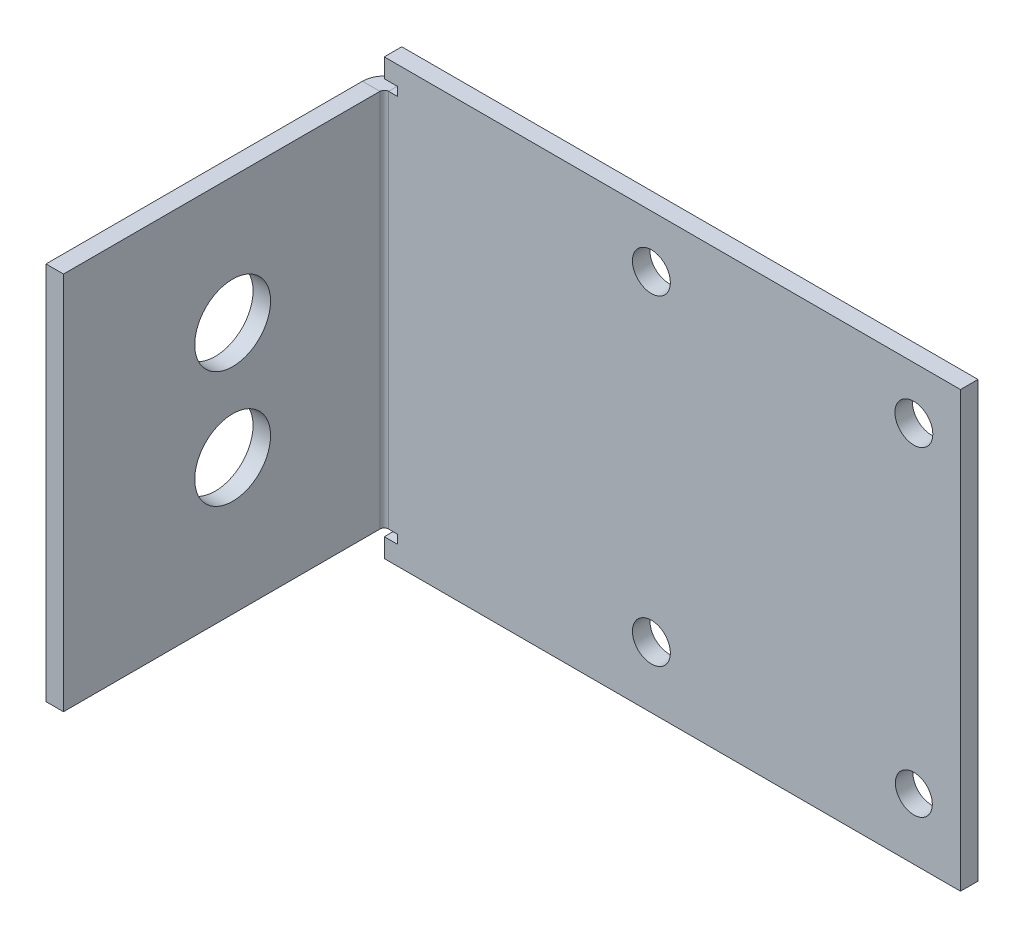
ISO-10303-21;
HEADER;
FILE_DESCRIPTION(('STEP AP214'),'2;1');
FILE_NAME('part.step','',(''),(''),'','','');
FILE_SCHEMA(('AUTOMOTIVE_DESIGN { 1 0 10303 214 1 1 1 1 }'));
ENDSEC;
DATA;
#1=APPLICATION_CONTEXT('core data for automotive mechanical design processes');
#2=APPLICATION_PROTOCOL_DEFINITION('international standard','automotive_design',2000,#1);
#3=PRODUCT_CONTEXT('',#1,'mechanical');
#4=PRODUCT('Part','Part','',(#3));
#5=PRODUCT_RELATED_PRODUCT_CATEGORY('part','',(#4));
#6=PRODUCT_DEFINITION_FORMATION('','',#4);
#7=PRODUCT_DEFINITION_CONTEXT('part definition',#1,'design');
#8=PRODUCT_DEFINITION('design','',#6,#7);
#9=PRODUCT_DEFINITION_SHAPE('','',#8);
#10=(LENGTH_UNIT() NAMED_UNIT(*) SI_UNIT(.MILLI.,.METRE.));
#11=(NAMED_UNIT(*) PLANE_ANGLE_UNIT() SI_UNIT($,.RADIAN.));
#12=(NAMED_UNIT(*) SI_UNIT($,.STERADIAN.) SOLID_ANGLE_UNIT());
#13=UNCERTAINTY_MEASURE_WITH_UNIT(LENGTH_MEASURE(1.E-05),#10,'distance_accuracy_value','');
#14=(GEOMETRIC_REPRESENTATION_CONTEXT(3) GLOBAL_UNCERTAINTY_ASSIGNED_CONTEXT((#13)) GLOBAL_UNIT_ASSIGNED_CONTEXT((#10,
#11,#12)) REPRESENTATION_CONTEXT('',''));
#15=CARTESIAN_POINT('',(0.,0.,0.));
#16=DIRECTION('',(0.,0.,1.));
#17=DIRECTION('',(1.,0.,0.));
#18=AXIS2_PLACEMENT_3D('',#15,#16,#17);
#19=CARTESIAN_POINT('',(-49.4,-37.25,-3.));
#20=DIRECTION('',(-1.,0.,0.));
#21=DIRECTION('',(0.,0.,1.));
#22=AXIS2_PLACEMENT_3D('',#19,#20,#21);
#23=PLANE('',#22);
#24=DIRECTION('',(0.,-1.,0.));
#25=VECTOR('',#24,1.);
#26=CARTESIAN_POINT('',(-49.4,-37.25,0.));
#27=LINE('',#26,#25);
#28=CARTESIAN_POINT('',(-49.4,-34.,0.));
#29=VERTEX_POINT('',#28);
#30=CARTESIAN_POINT('',(-49.4,-37.25,0.));
#31=VERTEX_POINT('',#30);
#32=EDGE_CURVE('E327',#29,#31,#27,.T.);
#33=ORIENTED_EDGE('',*,*,#32,.F.);
#34=DIRECTION('',(0.,0.,-1.));
#35=VECTOR('',#34,1.);
#36=CARTESIAN_POINT('',(-49.4,-34.,0.));
#37=LINE('',#36,#35);
#38=CARTESIAN_POINT('',(-49.4,-34.,-3.));
#39=VERTEX_POINT('',#38);
#40=EDGE_CURVE('E244',#29,#39,#37,.T.);
#41=ORIENTED_EDGE('',*,*,#40,.T.);
#42=DIRECTION('',(0.,-1.,0.));
#43=VECTOR('',#42,1.);
#44=CARTESIAN_POINT('',(-49.4,-37.25,-3.));
#45=LINE('',#44,#43);
#46=CARTESIAN_POINT('',(-49.4,-37.25,-3.));
#47=VERTEX_POINT('',#46);
#48=EDGE_CURVE('E311',#39,#47,#45,.T.);
#49=ORIENTED_EDGE('',*,*,#48,.T.);
#50=DIRECTION('',(0.,0.,1.));
#51=VECTOR('',#50,1.);
#52=CARTESIAN_POINT('',(-49.4,-37.25,-3.));
#53=LINE('',#52,#51);
#54=EDGE_CURVE('E50',#47,#31,#53,.T.);
#55=ORIENTED_EDGE('',*,*,#54,.T.);
#56=EDGE_LOOP('',(#33,#41,#49,#55));
#57=FACE_BOUND('',#56,.T.);
#58=ADVANCED_FACE('F40',(#57),#23,.T.);
#59=CARTESIAN_POINT('',(-49.4,37.25,-3.));
#60=VERTEX_POINT('',#59);
#61=CARTESIAN_POINT('',(-49.4,34.,-3.));
#62=VERTEX_POINT('',#61);
#63=EDGE_CURVE('E312',#60,#62,#45,.T.);
#64=ORIENTED_EDGE('',*,*,#63,.T.);
#65=DIRECTION('',(0.,0.,-1.));
#66=VECTOR('',#65,1.);
#67=CARTESIAN_POINT('',(-49.4,34.,0.));
#68=LINE('',#67,#66);
#69=CARTESIAN_POINT('',(-49.4,34.,0.));
#70=VERTEX_POINT('',#69);
#71=EDGE_CURVE('E268',#70,#62,#68,.T.);
#72=ORIENTED_EDGE('',*,*,#71,.F.);
#73=CARTESIAN_POINT('',(-49.4,37.25,0.));
#74=VERTEX_POINT('',#73);
#75=EDGE_CURVE('E328',#74,#70,#27,.T.);
#76=ORIENTED_EDGE('',*,*,#75,.F.);
#77=DIRECTION('',(0.,0.,1.));
#78=VECTOR('',#77,1.);
#79=CARTESIAN_POINT('',(-49.4,37.25,-3.));
#80=LINE('',#79,#78);
#81=EDGE_CURVE('E335',#60,#74,#80,.T.);
#82=ORIENTED_EDGE('',*,*,#81,.F.);
#83=EDGE_LOOP('',(#64,#72,#76,#82));
#84=FACE_BOUND('',#83,.T.);
#85=ADVANCED_FACE('F361',(#84),#23,.T.);
#86=CARTESIAN_POINT('',(0.,0.,-3.));
#87=DIRECTION('',(0.,0.,-1.));
#88=DIRECTION('',(-1.,0.,0.));
#89=AXIS2_PLACEMENT_3D('',#86,#87,#88);
#90=PLANE('',#89);
#91=CARTESIAN_POINT('',(41.4000000000019,-26.75,-3.));
#92=DIRECTION('',(0.,0.,-1.));
#93=DIRECTION('',(-1.,0.,0.));
#94=AXIS2_PLACEMENT_3D('',#91,#92,#93);
#95=CIRCLE('',#94,3.16643995393087);
#96=CARTESIAN_POINT('',(38.233560046071,-26.75,-3.));
#97=VERTEX_POINT('',#96);
#98=EDGE_CURVE('E414',#97,#97,#95,.T.);
#99=ORIENTED_EDGE('',*,*,#98,.F.);
#100=EDGE_LOOP('',(#99));
#101=FACE_BOUND('',#100,.T.);
#102=CARTESIAN_POINT('',(-3.59999999999815,-26.7500000000001,-3.));
#103=DIRECTION('',(0.,0.,-1.));
#104=DIRECTION('',(-1.,0.,0.));
#105=AXIS2_PLACEMENT_3D('',#102,#103,#104);
#106=CIRCLE('',#105,3.25);
#107=CARTESIAN_POINT('',(-6.84999999999815,-26.7500000000001,-3.));
#108=VERTEX_POINT('',#107);
#109=EDGE_CURVE('E544',#108,#108,#106,.T.);
#110=ORIENTED_EDGE('',*,*,#109,.F.);
#111=EDGE_LOOP('',(#110));
#112=FACE_BOUND('',#111,.T.);
#113=CARTESIAN_POINT('',(-3.59999999999816,28.2499999999999,-3.));
#114=DIRECTION('',(0.,0.,-1.));
#115=DIRECTION('',(-1.,0.,0.));
#116=AXIS2_PLACEMENT_3D('',#113,#114,#115);
#117=CIRCLE('',#116,3.25);
#118=CARTESIAN_POINT('',(-6.84999999999816,28.2499999999999,-3.));
#119=VERTEX_POINT('',#118);
#120=EDGE_CURVE('E527',#119,#119,#117,.T.);
#121=ORIENTED_EDGE('',*,*,#120,.F.);
#122=EDGE_LOOP('',(#121));
#123=FACE_BOUND('',#122,.T.);
#124=CARTESIAN_POINT('',(41.4000000000018,28.25,-3.));
#125=DIRECTION('',(0.,0.,-1.));
#126=DIRECTION('',(-1.,0.,0.));
#127=AXIS2_PLACEMENT_3D('',#124,#125,#126);
#128=CIRCLE('',#127,3.24999999999999);
#129=CARTESIAN_POINT('',(38.1500000000018,28.25,-3.));
#130=VERTEX_POINT('',#129);
#131=EDGE_CURVE('E397',#130,#130,#128,.T.);
#132=ORIENTED_EDGE('',*,*,#131,.F.);
#133=EDGE_LOOP('',(#132));
#134=FACE_BOUND('',#133,.T.);
#135=ORIENTED_EDGE('',*,*,#48,.F.);
#136=DIRECTION('',(1.,0.,0.));
#137=VECTOR('',#136,1.);
#138=CARTESIAN_POINT('',(0.,-34.,-3.));
#139=LINE('',#138,#137);
#140=CARTESIAN_POINT('',(-47.1634,-34.,-3.));
#141=VERTEX_POINT('',#140);
#142=EDGE_CURVE('E58',#39,#141,#139,.T.);
#143=ORIENTED_EDGE('',*,*,#142,.T.);
#144=DIRECTION('',(0.,1.,0.));
#145=VECTOR('',#144,1.);
#146=CARTESIAN_POINT('',(-47.1634,0.,-3.));
#147=LINE('',#146,#145);
#148=CARTESIAN_POINT('',(-47.1634,-32.5,-3.));
#149=VERTEX_POINT('',#148);
#150=EDGE_CURVE('E62',#141,#149,#147,.T.);
#151=ORIENTED_EDGE('',*,*,#150,.T.);
#152=DIRECTION('',(-1.,0.,0.));
#153=VECTOR('',#152,1.);
#154=CARTESIAN_POINT('',(0.,-32.5,-3.));
#155=LINE('',#154,#153);
#156=CARTESIAN_POINT('',(-48.6634,-32.5,-2.99999999999998));
#157=VERTEX_POINT('',#156);
#158=EDGE_CURVE('E294',#149,#157,#155,.T.);
#159=ORIENTED_EDGE('',*,*,#158,.T.);
#160=DIRECTION('',(0.,-1.,0.));
#161=VECTOR('',#160,1.);
#162=CARTESIAN_POINT('',(-48.6634,-32.5,-2.99999999999998));
#163=LINE('',#162,#161);
#164=CARTESIAN_POINT('',(-48.6634,32.5,-3.));
#165=VERTEX_POINT('',#164);
#166=EDGE_CURVE('E161',#157,#165,#163,.F.);
#167=ORIENTED_EDGE('',*,*,#166,.T.);
#168=DIRECTION('',(1.,0.,0.));
#169=VECTOR('',#168,1.);
#170=CARTESIAN_POINT('',(0.,32.5,-3.));
#171=LINE('',#170,#169);
#172=CARTESIAN_POINT('',(-47.1634,32.5,-3.));
#173=VERTEX_POINT('',#172);
#174=EDGE_CURVE('E291',#165,#173,#171,.T.);
#175=ORIENTED_EDGE('',*,*,#174,.T.);
#176=DIRECTION('',(0.,1.,0.));
#177=VECTOR('',#176,1.);
#178=CARTESIAN_POINT('',(-47.1634,0.,-3.));
#179=LINE('',#178,#177);
#180=CARTESIAN_POINT('',(-47.1634,34.,-3.));
#181=VERTEX_POINT('',#180);
#182=EDGE_CURVE('E288',#173,#181,#179,.T.);
#183=ORIENTED_EDGE('',*,*,#182,.T.);
#184=DIRECTION('',(-1.,0.,0.));
#185=VECTOR('',#184,1.);
#186=CARTESIAN_POINT('',(0.,34.,-3.));
#187=LINE('',#186,#185);
#188=EDGE_CURVE('E243',#181,#62,#187,.T.);
#189=ORIENTED_EDGE('',*,*,#188,.T.);
#190=ORIENTED_EDGE('',*,*,#63,.F.);
#191=DIRECTION('',(-1.,0.,0.));
#192=VECTOR('',#191,1.);
#193=CARTESIAN_POINT('',(-49.4,37.25,-3.));
#194=LINE('',#193,#192);
#195=CARTESIAN_POINT('',(49.4,37.25,-3.));
#196=VERTEX_POINT('',#195);
#197=EDGE_CURVE('E306',#196,#60,#194,.T.);
#198=ORIENTED_EDGE('',*,*,#197,.F.);
#199=DIRECTION('',(0.,1.,0.));
#200=VECTOR('',#199,1.);
#201=CARTESIAN_POINT('',(49.4,-37.25,-3.));
#202=LINE('',#201,#200);
#203=CARTESIAN_POINT('',(49.4,-37.25,-3.));
#204=VERTEX_POINT('',#203);
#205=EDGE_CURVE('E302',#204,#196,#202,.T.);
#206=ORIENTED_EDGE('',*,*,#205,.F.);
#207=DIRECTION('',(1.,0.,0.));
#208=VECTOR('',#207,1.);
#209=CARTESIAN_POINT('',(-49.4,-37.25,-3.));
#210=LINE('',#209,#208);
#211=EDGE_CURVE('E316',#47,#204,#210,.T.);
#212=ORIENTED_EDGE('',*,*,#211,.F.);
#213=EDGE_LOOP('',(#135,#143,#151,#159,#167,#175,#183,#189,#190,#198,#206,#212));
#214=FACE_BOUND('',#213,.T.);
#215=ADVANCED_FACE('F356',(#101,#112,#123,#134,#214),#90,.T.);
#216=CARTESIAN_POINT('',(0.,0.,0.));
#217=DIRECTION('',(0.,0.,-1.));
#218=DIRECTION('',(-1.,0.,0.));
#219=AXIS2_PLACEMENT_3D('',#216,#217,#218);
#220=PLANE('',#219);
#221=CARTESIAN_POINT('',(41.4000000000019,-26.75,0.));
#222=DIRECTION('',(0.,0.,1.));
#223=DIRECTION('',(1.,0.,0.));
#224=AXIS2_PLACEMENT_3D('',#221,#222,#223);
#225=CIRCLE('',#224,3.16643995393087);
#226=CARTESIAN_POINT('',(44.5664399539327,-26.75,0.));
#227=VERTEX_POINT('',#226);
#228=EDGE_CURVE('E535',#227,#227,#225,.T.);
#229=ORIENTED_EDGE('',*,*,#228,.F.);
#230=EDGE_LOOP('',(#229));
#231=FACE_BOUND('',#230,.T.);
#232=CARTESIAN_POINT('',(-3.59999999999815,-26.7500000000001,0.));
#233=DIRECTION('',(0.,0.,1.));
#234=DIRECTION('',(1.,0.,0.));
#235=AXIS2_PLACEMENT_3D('',#232,#233,#234);
#236=CIRCLE('',#235,3.25);
#237=CARTESIAN_POINT('',(-0.34999999999815,-26.7500000000001,0.));
#238=VERTEX_POINT('',#237);
#239=EDGE_CURVE('E531',#238,#238,#236,.T.);
#240=ORIENTED_EDGE('',*,*,#239,.F.);
#241=EDGE_LOOP('',(#240));
#242=FACE_BOUND('',#241,.T.);
#243=CARTESIAN_POINT('',(-3.59999999999816,28.2499999999999,0.));
#244=DIRECTION('',(0.,0.,1.));
#245=DIRECTION('',(1.,0.,0.));
#246=AXIS2_PLACEMENT_3D('',#243,#244,#245);
#247=CIRCLE('',#246,3.25);
#248=CARTESIAN_POINT('',(-0.349999999998164,28.2499999999999,0.));
#249=VERTEX_POINT('',#248);
#250=EDGE_CURVE('E398',#249,#249,#247,.T.);
#251=ORIENTED_EDGE('',*,*,#250,.F.);
#252=EDGE_LOOP('',(#251));
#253=FACE_BOUND('',#252,.T.);
#254=CARTESIAN_POINT('',(41.4000000000018,28.25,0.));
#255=DIRECTION('',(0.,0.,1.));
#256=DIRECTION('',(1.,0.,0.));
#257=AXIS2_PLACEMENT_3D('',#254,#255,#256);
#258=CIRCLE('',#257,3.24999999999999);
#259=CARTESIAN_POINT('',(44.6500000000018,28.25,0.));
#260=VERTEX_POINT('',#259);
#261=EDGE_CURVE('E395',#260,#260,#258,.T.);
#262=ORIENTED_EDGE('',*,*,#261,.F.);
#263=EDGE_LOOP('',(#262));
#264=FACE_BOUND('',#263,.T.);
#265=DIRECTION('',(1.,0.,0.));
#266=VECTOR('',#265,1.);
#267=CARTESIAN_POINT('',(-49.4,-34.,0.));
#268=LINE('',#267,#266);
#269=CARTESIAN_POINT('',(-47.1634,-34.,0.));
#270=VERTEX_POINT('',#269);
#271=EDGE_CURVE('E239',#29,#270,#268,.T.);
#272=ORIENTED_EDGE('',*,*,#271,.F.);
#273=ORIENTED_EDGE('',*,*,#32,.T.);
#274=DIRECTION('',(1.,0.,0.));
#275=VECTOR('',#274,1.);
#276=CARTESIAN_POINT('',(-49.4,-37.25,0.));
#277=LINE('',#276,#275);
#278=CARTESIAN_POINT('',(49.4,-37.25,0.));
#279=VERTEX_POINT('',#278);
#280=EDGE_CURVE('E307',#31,#279,#277,.T.);
#281=ORIENTED_EDGE('',*,*,#280,.T.);
#282=DIRECTION('',(0.,1.,0.));
#283=VECTOR('',#282,1.);
#284=CARTESIAN_POINT('',(49.4,-37.25,0.));
#285=LINE('',#284,#283);
#286=CARTESIAN_POINT('',(49.4,37.25,0.));
#287=VERTEX_POINT('',#286);
#288=EDGE_CURVE('E301',#279,#287,#285,.T.);
#289=ORIENTED_EDGE('',*,*,#288,.T.);
#290=DIRECTION('',(-1.,0.,0.));
#291=VECTOR('',#290,1.);
#292=CARTESIAN_POINT('',(-49.4,37.25,0.));
#293=LINE('',#292,#291);
#294=EDGE_CURVE('E323',#287,#74,#293,.T.);
#295=ORIENTED_EDGE('',*,*,#294,.T.);
#296=ORIENTED_EDGE('',*,*,#75,.T.);
#297=DIRECTION('',(-1.,0.,0.));
#298=VECTOR('',#297,1.);
#299=CARTESIAN_POINT('',(-47.1634,34.,0.));
#300=LINE('',#299,#298);
#301=CARTESIAN_POINT('',(-47.1634,34.,0.));
#302=VERTEX_POINT('',#301);
#303=EDGE_CURVE('E264',#302,#70,#300,.T.);
#304=ORIENTED_EDGE('',*,*,#303,.F.);
#305=DIRECTION('',(0.,1.,0.));
#306=VECTOR('',#305,1.);
#307=CARTESIAN_POINT('',(-47.1634,32.5,0.));
#308=LINE('',#307,#306);
#309=CARTESIAN_POINT('',(-47.1634,32.5,0.));
#310=VERTEX_POINT('',#309);
#311=EDGE_CURVE('E259',#310,#302,#308,.T.);
#312=ORIENTED_EDGE('',*,*,#311,.F.);
#313=DIRECTION('',(1.,0.,0.));
#314=VECTOR('',#313,1.);
#315=CARTESIAN_POINT('',(-48.6634,32.5,0.));
#316=LINE('',#315,#314);
#317=CARTESIAN_POINT('',(-48.6634,32.5,0.));
#318=VERTEX_POINT('',#317);
#319=EDGE_CURVE('E255',#318,#310,#316,.T.);
#320=ORIENTED_EDGE('',*,*,#319,.F.);
#321=DIRECTION('',(0.,-1.,0.));
#322=VECTOR('',#321,1.);
#323=CARTESIAN_POINT('',(-48.6634,-32.5,0.));
#324=LINE('',#323,#322);
#325=CARTESIAN_POINT('',(-48.6634,-32.5,0.));
#326=VERTEX_POINT('',#325);
#327=EDGE_CURVE('E226',#326,#318,#324,.F.);
#328=ORIENTED_EDGE('',*,*,#327,.F.);
#329=DIRECTION('',(-1.,0.,0.));
#330=VECTOR('',#329,1.);
#331=CARTESIAN_POINT('',(-47.1634,-32.5,0.));
#332=LINE('',#331,#330);
#333=CARTESIAN_POINT('',(-47.1634,-32.5,0.));
#334=VERTEX_POINT('',#333);
#335=EDGE_CURVE('E250',#334,#326,#332,.T.);
#336=ORIENTED_EDGE('',*,*,#335,.F.);
#337=DIRECTION('',(0.,1.,0.));
#338=VECTOR('',#337,1.);
#339=CARTESIAN_POINT('',(-47.1634,-34.,0.));
#340=LINE('',#339,#338);
#341=EDGE_CURVE('E245',#270,#334,#340,.T.);
#342=ORIENTED_EDGE('',*,*,#341,.F.);
#343=EDGE_LOOP('',(#272,#273,#281,#289,#295,#296,#304,#312,#320,#328,#336,#342));
#344=FACE_BOUND('',#343,.T.);
#345=ADVANCED_FACE('F349',(#231,#242,#253,#264,#344),#220,.F.);
#346=CARTESIAN_POINT('',(49.4,-37.25,-3.));
#347=DIRECTION('',(1.,0.,0.));
#348=DIRECTION('',(0.,0.,-1.));
#349=AXIS2_PLACEMENT_3D('',#346,#347,#348);
#350=PLANE('',#349);
#351=ORIENTED_EDGE('',*,*,#288,.F.);
#352=DIRECTION('',(0.,0.,1.));
#353=VECTOR('',#352,1.);
#354=CARTESIAN_POINT('',(49.4,-37.25,-3.));
#355=LINE('',#354,#353);
#356=EDGE_CURVE('E11',#204,#279,#355,.T.);
#357=ORIENTED_EDGE('',*,*,#356,.F.);
#358=ORIENTED_EDGE('',*,*,#205,.T.);
#359=DIRECTION('',(0.,0.,1.));
#360=VECTOR('',#359,1.);
#361=CARTESIAN_POINT('',(49.4,37.25,-3.));
#362=LINE('',#361,#360);
#363=EDGE_CURVE('E44',#196,#287,#362,.T.);
#364=ORIENTED_EDGE('',*,*,#363,.T.);
#365=EDGE_LOOP('',(#351,#357,#358,#364));
#366=FACE_BOUND('',#365,.T.);
#367=ADVANCED_FACE('F42',(#366),#350,.T.);
#368=CARTESIAN_POINT('',(-49.4,-37.25,-3.));
#369=DIRECTION('',(0.,-1.,0.));
#370=DIRECTION('',(0.,0.,-1.));
#371=AXIS2_PLACEMENT_3D('',#368,#369,#370);
#372=PLANE('',#371);
#373=ORIENTED_EDGE('',*,*,#280,.F.);
#374=ORIENTED_EDGE('',*,*,#54,.F.);
#375=ORIENTED_EDGE('',*,*,#211,.T.);
#376=ORIENTED_EDGE('',*,*,#356,.T.);
#377=EDGE_LOOP('',(#373,#374,#375,#376));
#378=FACE_BOUND('',#377,.T.);
#379=ADVANCED_FACE('F354',(#378),#372,.T.);
#380=CARTESIAN_POINT('',(-49.4,37.25,-3.));
#381=DIRECTION('',(0.,1.,0.));
#382=DIRECTION('',(0.,0.,1.));
#383=AXIS2_PLACEMENT_3D('',#380,#381,#382);
#384=PLANE('',#383);
#385=ORIENTED_EDGE('',*,*,#294,.F.);
#386=ORIENTED_EDGE('',*,*,#363,.F.);
#387=ORIENTED_EDGE('',*,*,#197,.T.);
#388=ORIENTED_EDGE('',*,*,#81,.T.);
#389=EDGE_LOOP('',(#385,#386,#387,#388));
#390=FACE_BOUND('',#389,.T.);
#391=ADVANCED_FACE('F347',(#390),#384,.T.);
#392=CARTESIAN_POINT('',(-49.4,-34.,0.));
#393=DIRECTION('',(0.,1.,0.));
#394=DIRECTION('',(0.,0.,1.));
#395=AXIS2_PLACEMENT_3D('',#392,#393,#394);
#396=PLANE('',#395);
#397=ORIENTED_EDGE('',*,*,#142,.F.);
#398=ORIENTED_EDGE('',*,*,#40,.F.);
#399=ORIENTED_EDGE('',*,*,#271,.T.);
#400=DIRECTION('',(0.,0.,-1.));
#401=VECTOR('',#400,1.);
#402=CARTESIAN_POINT('',(-47.1634,-34.,0.));
#403=LINE('',#402,#401);
#404=EDGE_CURVE('E249',#270,#141,#403,.T.);
#405=ORIENTED_EDGE('',*,*,#404,.T.);
#406=EDGE_LOOP('',(#397,#398,#399,#405));
#407=FACE_BOUND('',#406,.T.);
#408=ADVANCED_FACE('F390',(#407),#396,.T.);
#409=CARTESIAN_POINT('',(-47.1634,-34.,0.));
#410=DIRECTION('',(-1.,0.,0.));
#411=DIRECTION('',(0.,0.,1.));
#412=AXIS2_PLACEMENT_3D('',#409,#410,#411);
#413=PLANE('',#412);
#414=ORIENTED_EDGE('',*,*,#150,.F.);
#415=ORIENTED_EDGE('',*,*,#404,.F.);
#416=ORIENTED_EDGE('',*,*,#341,.T.);
#417=DIRECTION('',(0.,0.,-1.));
#418=VECTOR('',#417,1.);
#419=CARTESIAN_POINT('',(-47.1634,-32.5,0.));
#420=LINE('',#419,#418);
#421=EDGE_CURVE('E254',#334,#149,#420,.T.);
#422=ORIENTED_EDGE('',*,*,#421,.T.);
#423=EDGE_LOOP('',(#414,#415,#416,#422));
#424=FACE_BOUND('',#423,.T.);
#425=ADVANCED_FACE('F387',(#424),#413,.T.);
#426=CARTESIAN_POINT('',(-47.1634,-32.5,0.));
#427=DIRECTION('',(0.,-1.,0.));
#428=DIRECTION('',(0.,0.,-1.));
#429=AXIS2_PLACEMENT_3D('',#426,#427,#428);
#430=PLANE('',#429);
#431=ORIENTED_EDGE('',*,*,#158,.F.);
#432=ORIENTED_EDGE('',*,*,#421,.F.);
#433=ORIENTED_EDGE('',*,*,#335,.T.);
#434=DIRECTION('',(0.,0.,-1.));
#435=VECTOR('',#434,1.);
#436=CARTESIAN_POINT('',(-48.6634,-32.5,0.));
#437=LINE('',#436,#435);
#438=EDGE_CURVE('E221',#326,#157,#437,.T.);
#439=ORIENTED_EDGE('',*,*,#438,.T.);
#440=EDGE_LOOP('',(#431,#432,#433,#439));
#441=FACE_BOUND('',#440,.T.);
#442=ADVANCED_FACE('F381',(#441),#430,.T.);
#443=CARTESIAN_POINT('',(-48.6634,32.5,0.));
#444=DIRECTION('',(0.,1.,0.));
#445=DIRECTION('',(0.,0.,1.));
#446=AXIS2_PLACEMENT_3D('',#443,#444,#445);
#447=PLANE('',#446);
#448=ORIENTED_EDGE('',*,*,#174,.F.);
#449=DIRECTION('',(0.,0.,-1.));
#450=VECTOR('',#449,1.);
#451=CARTESIAN_POINT('',(-48.6634,32.5,0.));
#452=LINE('',#451,#450);
#453=EDGE_CURVE('E231',#318,#165,#452,.T.);
#454=ORIENTED_EDGE('',*,*,#453,.F.);
#455=ORIENTED_EDGE('',*,*,#319,.T.);
#456=DIRECTION('',(0.,0.,-1.));
#457=VECTOR('',#456,1.);
#458=CARTESIAN_POINT('',(-47.1634,32.5,0.));
#459=LINE('',#458,#457);
#460=EDGE_CURVE('E263',#310,#173,#459,.T.);
#461=ORIENTED_EDGE('',*,*,#460,.T.);
#462=EDGE_LOOP('',(#448,#454,#455,#461));
#463=FACE_BOUND('',#462,.T.);
#464=ADVANCED_FACE('F374',(#463),#447,.T.);
#465=CARTESIAN_POINT('',(-47.1634,32.5,0.));
#466=DIRECTION('',(-1.,0.,0.));
#467=DIRECTION('',(0.,0.,1.));
#468=AXIS2_PLACEMENT_3D('',#465,#466,#467);
#469=PLANE('',#468);
#470=ORIENTED_EDGE('',*,*,#182,.F.);
#471=ORIENTED_EDGE('',*,*,#460,.F.);
#472=ORIENTED_EDGE('',*,*,#311,.T.);
#473=DIRECTION('',(0.,0.,-1.));
#474=VECTOR('',#473,1.);
#475=CARTESIAN_POINT('',(-47.1634,34.,0.));
#476=LINE('',#475,#474);
#477=EDGE_CURVE('E235',#302,#181,#476,.T.);
#478=ORIENTED_EDGE('',*,*,#477,.T.);
#479=EDGE_LOOP('',(#470,#471,#472,#478));
#480=FACE_BOUND('',#479,.T.);
#481=ADVANCED_FACE('F371',(#480),#469,.T.);
#482=CARTESIAN_POINT('',(-47.1634,34.,0.));
#483=DIRECTION('',(0.,-1.,0.));
#484=DIRECTION('',(0.,0.,-1.));
#485=AXIS2_PLACEMENT_3D('',#482,#483,#484);
#486=PLANE('',#485);
#487=ORIENTED_EDGE('',*,*,#188,.F.);
#488=ORIENTED_EDGE('',*,*,#477,.F.);
#489=ORIENTED_EDGE('',*,*,#303,.T.);
#490=ORIENTED_EDGE('',*,*,#71,.T.);
#491=EDGE_LOOP('',(#487,#488,#489,#490));
#492=FACE_BOUND('',#491,.T.);
#493=ADVANCED_FACE('F363',(#492),#486,.T.);
#494=CARTESIAN_POINT('',(-48.6634,32.5,0.736600000000013));
#495=DIRECTION('',(0.,1.,0.));
#496=DIRECTION('',(0.,0.,1.));
#497=AXIS2_PLACEMENT_3D('',#494,#495,#496);
#498=PLANE('',#497);
#499=DIRECTION('',(-1.,0.,0.));
#500=VECTOR('',#499,1.);
#501=CARTESIAN_POINT('',(-49.4,32.5,0.736600000000011));
#502=LINE('',#501,#500);
#503=CARTESIAN_POINT('',(-49.4,32.5,0.736600000000011));
#504=VERTEX_POINT('',#503);
#505=CARTESIAN_POINT('',(-52.4,32.4999999999999,0.7366));
#506=VERTEX_POINT('',#505);
#507=EDGE_CURVE('E422',#504,#506,#502,.T.);
#508=ORIENTED_EDGE('',*,*,#507,.F.);
#509=CARTESIAN_POINT('',(-48.6634,32.5,0.736600000000013));
#510=DIRECTION('',(0.,-1.,0.));
#511=DIRECTION('',(0.,0.,-1.));
#512=AXIS2_PLACEMENT_3D('',#509,#510,#511);
#513=CIRCLE('',#512,0.736599999999997);
#514=EDGE_CURVE('E164',#318,#504,#513,.F.);
#515=ORIENTED_EDGE('',*,*,#514,.F.);
#516=ORIENTED_EDGE('',*,*,#453,.T.);
#517=CARTESIAN_POINT('',(-48.6634,32.4999999999999,0.736600000000013));
#518=DIRECTION('',(0.,-1.,0.));
#519=DIRECTION('',(0.,0.,-1.));
#520=AXIS2_PLACEMENT_3D('',#517,#518,#519);
#521=CIRCLE('',#520,3.7366);
#522=EDGE_CURVE('E219',#165,#506,#521,.F.);
#523=ORIENTED_EDGE('',*,*,#522,.T.);
#524=EDGE_LOOP('',(#508,#515,#516,#523));
#525=FACE_BOUND('',#524,.T.);
#526=ADVANCED_FACE('F377',(#525),#498,.T.);
#527=CARTESIAN_POINT('',(-48.6634,-32.5,0.736600000000013));
#528=DIRECTION('',(0.,1.,0.));
#529=DIRECTION('',(0.,0.,1.));
#530=AXIS2_PLACEMENT_3D('',#527,#528,#529);
#531=PLANE('',#530);
#532=CARTESIAN_POINT('',(-48.6634,-32.5,0.736600000000013));
#533=DIRECTION('',(0.,-1.,0.));
#534=DIRECTION('',(0.,0.,-1.));
#535=AXIS2_PLACEMENT_3D('',#532,#533,#534);
#536=CIRCLE('',#535,0.736599999999997);
#537=CARTESIAN_POINT('',(-49.4,-32.5,0.736600000000011));
#538=VERTEX_POINT('',#537);
#539=EDGE_CURVE('E171',#538,#326,#536,.T.);
#540=ORIENTED_EDGE('',*,*,#539,.F.);
#541=DIRECTION('',(-1.,0.,0.));
#542=VECTOR('',#541,1.);
#543=CARTESIAN_POINT('',(-49.4,-32.5,0.736600000000011));
#544=LINE('',#543,#542);
#545=CARTESIAN_POINT('',(-52.4,-32.5,0.7366));
#546=VERTEX_POINT('',#545);
#547=EDGE_CURVE('E168',#538,#546,#544,.T.);
#548=ORIENTED_EDGE('',*,*,#547,.T.);
#549=CARTESIAN_POINT('',(-48.6634,-32.5,0.736600000000013));
#550=DIRECTION('',(0.,-1.,0.));
#551=DIRECTION('',(0.,0.,-1.));
#552=AXIS2_PLACEMENT_3D('',#549,#550,#551);
#553=CIRCLE('',#552,3.7366);
#554=EDGE_CURVE('E154',#546,#157,#553,.T.);
#555=ORIENTED_EDGE('',*,*,#554,.T.);
#556=ORIENTED_EDGE('',*,*,#438,.F.);
#557=EDGE_LOOP('',(#540,#548,#555,#556));
#558=FACE_BOUND('',#557,.T.);
#559=ADVANCED_FACE('F169',(#558),#531,.F.);
#560=CARTESIAN_POINT('',(-48.6634,-32.5,0.736600000000013));
#561=DIRECTION('',(0.,-1.,0.));
#562=DIRECTION('',(-1.,0.,0.));
#563=AXIS2_PLACEMENT_3D('',#560,#561,#562);
#564=CYLINDRICAL_SURFACE('',#563,3.7366);
#565=ORIENTED_EDGE('',*,*,#166,.F.);
#566=ORIENTED_EDGE('',*,*,#554,.F.);
#567=DIRECTION('',(0.,1.,0.));
#568=VECTOR('',#567,1.);
#569=CARTESIAN_POINT('',(-52.4,0.,0.7366));
#570=LINE('',#569,#568);
#571=EDGE_CURVE('E158',#546,#506,#570,.T.);
#572=ORIENTED_EDGE('',*,*,#571,.T.);
#573=ORIENTED_EDGE('',*,*,#522,.F.);
#574=EDGE_LOOP('',(#565,#566,#572,#573));
#575=FACE_BOUND('',#574,.T.);
#576=ADVANCED_FACE('F156',(#575),#564,.T.);
#577=CARTESIAN_POINT('',(-48.6634,-32.5,0.736600000000013));
#578=DIRECTION('',(0.,-1.,0.));
#579=DIRECTION('',(-1.,0.,0.));
#580=AXIS2_PLACEMENT_3D('',#577,#578,#579);
#581=CYLINDRICAL_SURFACE('',#580,0.736599999999997);
#582=ORIENTED_EDGE('',*,*,#327,.T.);
#583=ORIENTED_EDGE('',*,*,#514,.T.);
#584=DIRECTION('',(0.,-1.,0.));
#585=VECTOR('',#584,1.);
#586=CARTESIAN_POINT('',(-49.4,32.5,0.736600000000011));
#587=LINE('',#586,#585);
#588=EDGE_CURVE('E176',#504,#538,#587,.T.);
#589=ORIENTED_EDGE('',*,*,#588,.T.);
#590=ORIENTED_EDGE('',*,*,#539,.T.);
#591=EDGE_LOOP('',(#582,#583,#589,#590));
#592=FACE_BOUND('',#591,.T.);
#593=ADVANCED_FACE('F383',(#592),#581,.F.);
#594=CARTESIAN_POINT('',(-52.4,32.5,0.));
#595=DIRECTION('',(0.,-1.,0.));
#596=DIRECTION('',(0.,0.,-1.));
#597=AXIS2_PLACEMENT_3D('',#594,#595,#596);
#598=PLANE('',#597);
#599=ORIENTED_EDGE('',*,*,#507,.T.);
#600=DIRECTION('',(0.,0.,-1.));
#601=VECTOR('',#600,1.);
#602=CARTESIAN_POINT('',(-52.4,32.5,0.));
#603=LINE('',#602,#601);
#604=CARTESIAN_POINT('',(-52.4000000000002,32.5,55.));
#605=VERTEX_POINT('',#604);
#606=EDGE_CURVE('E184',#605,#506,#603,.T.);
#607=ORIENTED_EDGE('',*,*,#606,.F.);
#608=DIRECTION('',(1.,0.,0.));
#609=VECTOR('',#608,1.);
#610=CARTESIAN_POINT('',(-52.4000000000002,32.5,55.));
#611=LINE('',#610,#609);
#612=CARTESIAN_POINT('',(-49.4000000000002,32.5,55.));
#613=VERTEX_POINT('',#612);
#614=EDGE_CURVE('E198',#605,#613,#611,.T.);
#615=ORIENTED_EDGE('',*,*,#614,.T.);
#616=DIRECTION('',(0.,0.,-1.));
#617=VECTOR('',#616,1.);
#618=CARTESIAN_POINT('',(-49.4,32.5,0.));
#619=LINE('',#618,#617);
#620=EDGE_CURVE('E186',#613,#504,#619,.T.);
#621=ORIENTED_EDGE('',*,*,#620,.T.);
#622=EDGE_LOOP('',(#599,#607,#615,#621));
#623=FACE_BOUND('',#622,.T.);
#624=ADVANCED_FACE('F427',(#623),#598,.F.);
#625=CARTESIAN_POINT('',(-52.4000000000002,-32.5,55.));
#626=DIRECTION('',(0.,1.,0.));
#627=DIRECTION('',(0.,0.,1.));
#628=AXIS2_PLACEMENT_3D('',#625,#626,#627);
#629=PLANE('',#628);
#630=ORIENTED_EDGE('',*,*,#547,.F.);
#631=DIRECTION('',(0.,0.,1.));
#632=VECTOR('',#631,1.);
#633=CARTESIAN_POINT('',(-49.4000000000002,-32.5,55.));
#634=LINE('',#633,#632);
#635=CARTESIAN_POINT('',(-49.4000000000002,-32.5,55.));
#636=VERTEX_POINT('',#635);
#637=EDGE_CURVE('E207',#538,#636,#634,.T.);
#638=ORIENTED_EDGE('',*,*,#637,.T.);
#639=DIRECTION('',(1.,0.,0.));
#640=VECTOR('',#639,1.);
#641=CARTESIAN_POINT('',(-52.4000000000002,-32.5,55.));
#642=LINE('',#641,#640);
#643=CARTESIAN_POINT('',(-52.4000000000002,-32.5,55.));
#644=VERTEX_POINT('',#643);
#645=EDGE_CURVE('E190',#644,#636,#642,.T.);
#646=ORIENTED_EDGE('',*,*,#645,.F.);
#647=DIRECTION('',(0.,0.,1.));
#648=VECTOR('',#647,1.);
#649=CARTESIAN_POINT('',(-52.4000000000002,-32.5,55.));
#650=LINE('',#649,#648);
#651=EDGE_CURVE('E181',#546,#644,#650,.T.);
#652=ORIENTED_EDGE('',*,*,#651,.F.);
#653=EDGE_LOOP('',(#630,#638,#646,#652));
#654=FACE_BOUND('',#653,.T.);
#655=ADVANCED_FACE('F188',(#654),#629,.F.);
#656=CARTESIAN_POINT('',(-52.4,0.,-1.84981317614429E-13));
#657=DIRECTION('',(1.,0.,0.));
#658=DIRECTION('',(0.,0.,-1.));
#659=AXIS2_PLACEMENT_3D('',#656,#657,#658);
#660=PLANE('',#659);
#661=CARTESIAN_POINT('',(-52.4000000000001,10.7500000000194,25.9999999999886));
#662=DIRECTION('',(1.,0.,0.));
#663=DIRECTION('',(0.,0.,-1.));
#664=AXIS2_PLACEMENT_3D('',#661,#662,#663);
#665=CIRCLE('',#664,6.5);
#666=CARTESIAN_POINT('',(-52.4000000000001,10.7500000000194,19.4999999999886));
#667=VERTEX_POINT('',#666);
#668=EDGE_CURVE('E410',#667,#667,#665,.T.);
#669=ORIENTED_EDGE('',*,*,#668,.T.);
#670=EDGE_LOOP('',(#669));
#671=FACE_BOUND('',#670,.T.);
#672=CARTESIAN_POINT('',(-52.4000000000001,-9.24999999998062,25.9999999999886));
#673=DIRECTION('',(1.,0.,0.));
#674=DIRECTION('',(0.,0.,-1.));
#675=AXIS2_PLACEMENT_3D('',#672,#673,#674);
#676=CIRCLE('',#675,6.5);
#677=CARTESIAN_POINT('',(-52.4000000000001,-9.24999999998062,19.4999999999886));
#678=VERTEX_POINT('',#677);
#679=EDGE_CURVE('E403',#678,#678,#676,.T.);
#680=ORIENTED_EDGE('',*,*,#679,.T.);
#681=EDGE_LOOP('',(#680));
#682=FACE_BOUND('',#681,.T.);
#683=ORIENTED_EDGE('',*,*,#571,.F.);
#684=ORIENTED_EDGE('',*,*,#651,.T.);
#685=DIRECTION('',(0.,1.,0.));
#686=VECTOR('',#685,1.);
#687=CARTESIAN_POINT('',(-52.4000000000002,32.5,55.));
#688=LINE('',#687,#686);
#689=EDGE_CURVE('E193',#644,#605,#688,.T.);
#690=ORIENTED_EDGE('',*,*,#689,.T.);
#691=ORIENTED_EDGE('',*,*,#606,.T.);
#692=EDGE_LOOP('',(#683,#684,#690,#691));
#693=FACE_BOUND('',#692,.T.);
#694=ADVANCED_FACE('F180',(#671,#682,#693),#660,.F.);
#695=CARTESIAN_POINT('',(-49.4,0.,-1.745068735979E-13));
#696=DIRECTION('',(1.,0.,0.));
#697=DIRECTION('',(0.,0.,-1.));
#698=AXIS2_PLACEMENT_3D('',#695,#696,#697);
#699=PLANE('',#698);
#700=CARTESIAN_POINT('',(-49.4000000000001,10.7500000000194,25.9999999999886));
#701=DIRECTION('',(1.,0.,0.));
#702=DIRECTION('',(0.,0.,-1.));
#703=AXIS2_PLACEMENT_3D('',#700,#701,#702);
#704=CIRCLE('',#703,6.5);
#705=CARTESIAN_POINT('',(-49.4000000000001,10.7500000000194,19.4999999999886));
#706=VERTEX_POINT('',#705);
#707=EDGE_CURVE('E401',#706,#706,#704,.T.);
#708=ORIENTED_EDGE('',*,*,#707,.F.);
#709=EDGE_LOOP('',(#708));
#710=FACE_BOUND('',#709,.T.);
#711=CARTESIAN_POINT('',(-49.4000000000001,-9.24999999998062,25.9999999999886));
#712=DIRECTION('',(1.,0.,0.));
#713=DIRECTION('',(0.,0.,-1.));
#714=AXIS2_PLACEMENT_3D('',#711,#712,#713);
#715=CIRCLE('',#714,6.5);
#716=CARTESIAN_POINT('',(-49.4000000000001,-9.24999999998062,19.4999999999886));
#717=VERTEX_POINT('',#716);
#718=EDGE_CURVE('E404',#717,#717,#715,.T.);
#719=ORIENTED_EDGE('',*,*,#718,.F.);
#720=EDGE_LOOP('',(#719));
#721=FACE_BOUND('',#720,.T.);
#722=ORIENTED_EDGE('',*,*,#637,.F.);
#723=ORIENTED_EDGE('',*,*,#588,.F.);
#724=ORIENTED_EDGE('',*,*,#620,.F.);
#725=DIRECTION('',(0.,1.,0.));
#726=VECTOR('',#725,1.);
#727=CARTESIAN_POINT('',(-49.4000000000002,32.5,55.));
#728=LINE('',#727,#726);
#729=EDGE_CURVE('E201',#636,#613,#728,.T.);
#730=ORIENTED_EDGE('',*,*,#729,.F.);
#731=EDGE_LOOP('',(#722,#723,#724,#730));
#732=FACE_BOUND('',#731,.T.);
#733=ADVANCED_FACE('F430',(#710,#721,#732),#699,.T.);
#734=CARTESIAN_POINT('',(-52.4000000000002,32.5,55.));
#735=DIRECTION('',(0.,0.,-1.));
#736=DIRECTION('',(-1.,0.,0.));
#737=AXIS2_PLACEMENT_3D('',#734,#735,#736);
#738=PLANE('',#737);
#739=ORIENTED_EDGE('',*,*,#729,.T.);
#740=ORIENTED_EDGE('',*,*,#614,.F.);
#741=ORIENTED_EDGE('',*,*,#689,.F.);
#742=ORIENTED_EDGE('',*,*,#645,.T.);
#743=EDGE_LOOP('',(#739,#740,#741,#742));
#744=FACE_BOUND('',#743,.T.);
#745=ADVANCED_FACE('F433',(#744),#738,.F.);
#746=CARTESIAN_POINT('',(-59.4000000000001,-9.24999999998062,25.9999999999886));
#747=DIRECTION('',(1.,0.,0.));
#748=DIRECTION('',(0.,0.,-1.));
#749=AXIS2_PLACEMENT_3D('',#746,#747,#748);
#750=CYLINDRICAL_SURFACE('',#749,6.5);
#751=ORIENTED_EDGE('',*,*,#718,.T.);
#752=EDGE_LOOP('',(#751));
#753=FACE_BOUND('',#752,.T.);
#754=ORIENTED_EDGE('',*,*,#679,.F.);
#755=EDGE_LOOP('',(#754));
#756=FACE_BOUND('',#755,.T.);
#757=ADVANCED_FACE('F436',(#753,#756),#750,.F.);
#758=CARTESIAN_POINT('',(-59.4000000000001,10.7500000000194,25.9999999999886));
#759=DIRECTION('',(1.,0.,0.));
#760=DIRECTION('',(0.,0.,-1.));
#761=AXIS2_PLACEMENT_3D('',#758,#759,#760);
#762=CYLINDRICAL_SURFACE('',#761,6.5);
#763=ORIENTED_EDGE('',*,*,#707,.T.);
#764=EDGE_LOOP('',(#763));
#765=FACE_BOUND('',#764,.T.);
#766=ORIENTED_EDGE('',*,*,#668,.F.);
#767=EDGE_LOOP('',(#766));
#768=FACE_BOUND('',#767,.T.);
#769=ADVANCED_FACE('F442',(#765,#768),#762,.F.);
#770=CARTESIAN_POINT('',(41.4000000000018,28.25,-10.));
#771=DIRECTION('',(0.,0.,1.));
#772=DIRECTION('',(1.,0.,0.));
#773=AXIS2_PLACEMENT_3D('',#770,#771,#772);
#774=CYLINDRICAL_SURFACE('',#773,3.24999999999999);
#775=ORIENTED_EDGE('',*,*,#131,.T.);
#776=EDGE_LOOP('',(#775));
#777=FACE_BOUND('',#776,.T.);
#778=ORIENTED_EDGE('',*,*,#261,.T.);
#779=EDGE_LOOP('',(#778));
#780=FACE_BOUND('',#779,.T.);
#781=ADVANCED_FACE('F507',(#777,#780),#774,.F.);
#782=CARTESIAN_POINT('',(-3.59999999999816,28.2499999999999,-10.));
#783=DIRECTION('',(0.,0.,1.));
#784=DIRECTION('',(1.,0.,0.));
#785=AXIS2_PLACEMENT_3D('',#782,#783,#784);
#786=CYLINDRICAL_SURFACE('',#785,3.25);
#787=ORIENTED_EDGE('',*,*,#120,.T.);
#788=EDGE_LOOP('',(#787));
#789=FACE_BOUND('',#788,.T.);
#790=ORIENTED_EDGE('',*,*,#250,.T.);
#791=EDGE_LOOP('',(#790));
#792=FACE_BOUND('',#791,.T.);
#793=ADVANCED_FACE('F510',(#789,#792),#786,.F.);
#794=CARTESIAN_POINT('',(-3.59999999999815,-26.7500000000001,-10.));
#795=DIRECTION('',(0.,0.,1.));
#796=DIRECTION('',(1.,0.,0.));
#797=AXIS2_PLACEMENT_3D('',#794,#795,#796);
#798=CYLINDRICAL_SURFACE('',#797,3.25);
#799=ORIENTED_EDGE('',*,*,#109,.T.);
#800=EDGE_LOOP('',(#799));
#801=FACE_BOUND('',#800,.T.);
#802=ORIENTED_EDGE('',*,*,#239,.T.);
#803=EDGE_LOOP('',(#802));
#804=FACE_BOUND('',#803,.T.);
#805=ADVANCED_FACE('F515',(#801,#804),#798,.F.);
#806=CARTESIAN_POINT('',(41.4000000000019,-26.75,-10.));
#807=DIRECTION('',(0.,0.,1.));
#808=DIRECTION('',(1.,0.,0.));
#809=AXIS2_PLACEMENT_3D('',#806,#807,#808);
#810=CYLINDRICAL_SURFACE('',#809,3.16643995393087);
#811=ORIENTED_EDGE('',*,*,#98,.T.);
#812=EDGE_LOOP('',(#811));
#813=FACE_BOUND('',#812,.T.);
#814=ORIENTED_EDGE('',*,*,#228,.T.);
#815=EDGE_LOOP('',(#814));
#816=FACE_BOUND('',#815,.T.);
#817=ADVANCED_FACE('F512',(#813,#816),#810,.F.);
#818=CLOSED_SHELL('',(#58,#85,#215,#345,#367,#379,#391,#408,#425,#442,#464,#481,#493,#526,#559,
#576,#593,#624,#655,#694,#733,#745,#757,#769,#781,#793,#805,#817));
#819=MANIFOLD_SOLID_BREP('B2',#818);
#820=ADVANCED_BREP_SHAPE_REPRESENTATION('',(#18,#819),#14);
#821=SHAPE_DEFINITION_REPRESENTATION(#9,#820);
ENDSEC;
END-ISO-10303-21;
